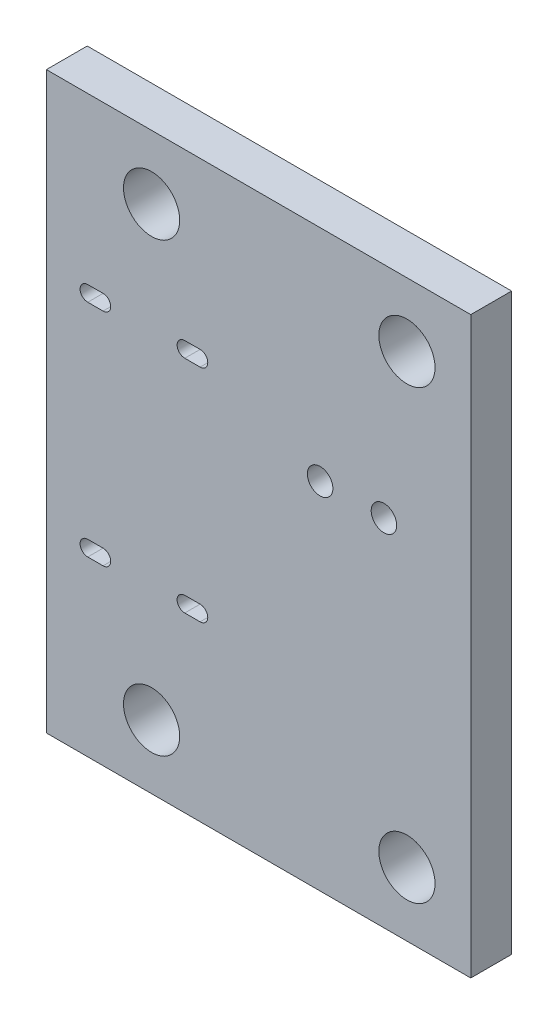
ISO-10303-21;
HEADER;
FILE_DESCRIPTION(('STEP AP214'),'2;1');
FILE_NAME('part.step','',(''),(''),'','','');
FILE_SCHEMA(('AUTOMOTIVE_DESIGN { 1 0 10303 214 1 1 1 1 }'));
ENDSEC;
DATA;
#1=APPLICATION_CONTEXT('core data for automotive mechanical design processes');
#2=APPLICATION_PROTOCOL_DEFINITION('international standard','automotive_design',2000,#1);
#3=PRODUCT_CONTEXT('',#1,'mechanical');
#4=PRODUCT('Part','Part','',(#3));
#5=PRODUCT_RELATED_PRODUCT_CATEGORY('part','',(#4));
#6=PRODUCT_DEFINITION_FORMATION('','',#4);
#7=PRODUCT_DEFINITION_CONTEXT('part definition',#1,'design');
#8=PRODUCT_DEFINITION('design','',#6,#7);
#9=PRODUCT_DEFINITION_SHAPE('','',#8);
#10=(LENGTH_UNIT() NAMED_UNIT(*) SI_UNIT(.MILLI.,.METRE.));
#11=(NAMED_UNIT(*) PLANE_ANGLE_UNIT() SI_UNIT($,.RADIAN.));
#12=(NAMED_UNIT(*) SI_UNIT($,.STERADIAN.) SOLID_ANGLE_UNIT());
#13=UNCERTAINTY_MEASURE_WITH_UNIT(LENGTH_MEASURE(1.E-05),#10,'distance_accuracy_value','');
#14=(GEOMETRIC_REPRESENTATION_CONTEXT(3) GLOBAL_UNCERTAINTY_ASSIGNED_CONTEXT((#13)) GLOBAL_UNIT_ASSIGNED_CONTEXT((#10,
#11,#12)) REPRESENTATION_CONTEXT('',''));
#15=CARTESIAN_POINT('',(0.,0.,0.));
#16=DIRECTION('',(0.,0.,1.));
#17=DIRECTION('',(1.,0.,0.));
#18=AXIS2_PLACEMENT_3D('',#15,#16,#17);
#19=CARTESIAN_POINT('',(120.,-85.,-0.8));
#20=DIRECTION('',(0.,0.,1.));
#21=DIRECTION('',(1.,0.,0.));
#22=AXIS2_PLACEMENT_3D('',#19,#20,#21);
#23=CYLINDRICAL_SURFACE('',#22,1.1);
#24=DIRECTION('',(0.,0.,1.));
#25=VECTOR('',#24,1.);
#26=CARTESIAN_POINT('',(121.1,-85.,-0.8));
#27=LINE('',#26,#25);
#28=CARTESIAN_POINT('',(121.1,-85.,0.));
#29=VERTEX_POINT('',#28);
#30=CARTESIAN_POINT('',(121.1,-85.,1.6));
#31=VERTEX_POINT('',#30);
#32=EDGE_CURVE('E11',#29,#31,#27,.T.);
#33=ORIENTED_EDGE('',*,*,#32,.F.);
#34=CARTESIAN_POINT('',(120.,-85.,0.));
#35=DIRECTION('',(0.,0.,1.));
#36=DIRECTION('',(1.,0.,0.));
#37=AXIS2_PLACEMENT_3D('',#34,#35,#36);
#38=CIRCLE('',#37,1.1);
#39=EDGE_CURVE('E295',#29,#29,#38,.T.);
#40=ORIENTED_EDGE('',*,*,#39,.F.);
#41=ORIENTED_EDGE('',*,*,#32,.T.);
#42=CARTESIAN_POINT('',(120.,-85.,1.6));
#43=DIRECTION('',(0.,0.,1.));
#44=DIRECTION('',(1.,0.,0.));
#45=AXIS2_PLACEMENT_3D('',#42,#43,#44);
#46=CIRCLE('',#45,1.1);
#47=EDGE_CURVE('E285',#31,#31,#46,.T.);
#48=ORIENTED_EDGE('',*,*,#47,.T.);
#49=EDGE_LOOP('',(#33,#40,#41,#48));
#50=FACE_BOUND('',#49,.T.);
#51=ADVANCED_FACE('F17',(#50),#23,.F.);
#52=CARTESIAN_POINT('',(118.1,-88.98,0.));
#53=DIRECTION('',(0.,-1.,0.));
#54=DIRECTION('',(0.,0.,-1.));
#55=AXIS2_PLACEMENT_3D('',#52,#53,#54);
#56=PLANE('',#55);
#57=DIRECTION('',(0.,0.,1.));
#58=VECTOR('',#57,1.);
#59=CARTESIAN_POINT('',(118.1,-88.98,0.));
#60=LINE('',#59,#58);
#61=CARTESIAN_POINT('',(118.1,-88.98,0.));
#62=VERTEX_POINT('',#61);
#63=CARTESIAN_POINT('',(118.1,-88.98,1.6));
#64=VERTEX_POINT('',#63);
#65=EDGE_CURVE('E21',#62,#64,#60,.T.);
#66=ORIENTED_EDGE('',*,*,#65,.T.);
#67=DIRECTION('',(-1.,0.,0.));
#68=VECTOR('',#67,1.);
#69=CARTESIAN_POINT('',(118.1,-88.98,1.6));
#70=LINE('',#69,#68);
#71=CARTESIAN_POINT('',(117.5,-88.98,1.6));
#72=VERTEX_POINT('',#71);
#73=EDGE_CURVE('E380',#64,#72,#70,.T.);
#74=ORIENTED_EDGE('',*,*,#73,.T.);
#75=DIRECTION('',(0.,0.,1.));
#76=VECTOR('',#75,1.);
#77=CARTESIAN_POINT('',(117.5,-88.98,0.));
#78=LINE('',#77,#76);
#79=CARTESIAN_POINT('',(117.5,-88.98,0.));
#80=VERTEX_POINT('',#79);
#81=EDGE_CURVE('E28',#80,#72,#78,.T.);
#82=ORIENTED_EDGE('',*,*,#81,.F.);
#83=DIRECTION('',(-1.,0.,0.));
#84=VECTOR('',#83,1.);
#85=CARTESIAN_POINT('',(118.1,-88.98,0.));
#86=LINE('',#85,#84);
#87=EDGE_CURVE('E351',#62,#80,#86,.T.);
#88=ORIENTED_EDGE('',*,*,#87,.F.);
#89=EDGE_LOOP('',(#66,#74,#82,#88));
#90=FACE_BOUND('',#89,.T.);
#91=ADVANCED_FACE('F489',(#90),#56,.T.);
#92=CARTESIAN_POINT('',(117.5,-89.28,0.));
#93=DIRECTION('',(0.,0.,-1.));
#94=DIRECTION('',(1.,0.,0.));
#95=AXIS2_PLACEMENT_3D('',#92,#93,#94);
#96=CYLINDRICAL_SURFACE('',#95,0.3);
#97=ORIENTED_EDGE('',*,*,#81,.T.);
#98=CARTESIAN_POINT('',(117.5,-89.28,1.6));
#99=DIRECTION('',(0.,0.,1.));
#100=DIRECTION('',(1.,0.,0.));
#101=AXIS2_PLACEMENT_3D('',#98,#99,#100);
#102=CIRCLE('',#101,0.3);
#103=CARTESIAN_POINT('',(117.5,-89.58,1.6));
#104=VERTEX_POINT('',#103);
#105=EDGE_CURVE('E413',#72,#104,#102,.T.);
#106=ORIENTED_EDGE('',*,*,#105,.T.);
#107=DIRECTION('',(0.,0.,1.));
#108=VECTOR('',#107,1.);
#109=CARTESIAN_POINT('',(117.5,-89.58,0.));
#110=LINE('',#109,#108);
#111=CARTESIAN_POINT('',(117.5,-89.58,0.));
#112=VERTEX_POINT('',#111);
#113=EDGE_CURVE('E432',#112,#104,#110,.T.);
#114=ORIENTED_EDGE('',*,*,#113,.F.);
#115=CARTESIAN_POINT('',(117.5,-89.28,0.));
#116=DIRECTION('',(0.,0.,1.));
#117=DIRECTION('',(1.,0.,0.));
#118=AXIS2_PLACEMENT_3D('',#115,#116,#117);
#119=CIRCLE('',#118,0.3);
#120=EDGE_CURVE('E355',#80,#112,#119,.T.);
#121=ORIENTED_EDGE('',*,*,#120,.F.);
#122=EDGE_LOOP('',(#97,#106,#114,#121));
#123=FACE_BOUND('',#122,.T.);
#124=ADVANCED_FACE('F484',(#123),#96,.F.);
#125=CARTESIAN_POINT('',(117.5,-89.58,0.));
#126=DIRECTION('',(0.,1.,0.));
#127=DIRECTION('',(1.,0.,0.));
#128=AXIS2_PLACEMENT_3D('',#125,#126,#127);
#129=PLANE('',#128);
#130=ORIENTED_EDGE('',*,*,#113,.T.);
#131=DIRECTION('',(1.,0.,0.));
#132=VECTOR('',#131,1.);
#133=CARTESIAN_POINT('',(117.5,-89.58,1.6));
#134=LINE('',#133,#132);
#135=CARTESIAN_POINT('',(118.1,-89.58,1.6));
#136=VERTEX_POINT('',#135);
#137=EDGE_CURVE('E363',#104,#136,#134,.T.);
#138=ORIENTED_EDGE('',*,*,#137,.T.);
#139=DIRECTION('',(0.,0.,1.));
#140=VECTOR('',#139,1.);
#141=CARTESIAN_POINT('',(118.1,-89.58,0.));
#142=LINE('',#141,#140);
#143=CARTESIAN_POINT('',(118.1,-89.58,0.));
#144=VERTEX_POINT('',#143);
#145=EDGE_CURVE('E269',#144,#136,#142,.T.);
#146=ORIENTED_EDGE('',*,*,#145,.F.);
#147=DIRECTION('',(1.,0.,0.));
#148=VECTOR('',#147,1.);
#149=CARTESIAN_POINT('',(117.5,-89.58,0.));
#150=LINE('',#149,#148);
#151=EDGE_CURVE('E300',#112,#144,#150,.T.);
#152=ORIENTED_EDGE('',*,*,#151,.F.);
#153=EDGE_LOOP('',(#130,#138,#146,#152));
#154=FACE_BOUND('',#153,.T.);
#155=ADVANCED_FACE('F694',(#154),#129,.T.);
#156=CARTESIAN_POINT('',(118.1,-89.28,0.));
#157=DIRECTION('',(0.,0.,-1.));
#158=DIRECTION('',(1.,0.,0.));
#159=AXIS2_PLACEMENT_3D('',#156,#157,#158);
#160=CYLINDRICAL_SURFACE('',#159,0.3);
#161=ORIENTED_EDGE('',*,*,#145,.T.);
#162=CARTESIAN_POINT('',(118.1,-89.28,1.6));
#163=DIRECTION('',(0.,0.,1.));
#164=DIRECTION('',(1.,0.,0.));
#165=AXIS2_PLACEMENT_3D('',#162,#163,#164);
#166=CIRCLE('',#165,0.3);
#167=EDGE_CURVE('E289',#136,#64,#166,.T.);
#168=ORIENTED_EDGE('',*,*,#167,.T.);
#169=ORIENTED_EDGE('',*,*,#65,.F.);
#170=CARTESIAN_POINT('',(118.1,-89.28,0.));
#171=DIRECTION('',(0.,0.,1.));
#172=DIRECTION('',(1.,0.,0.));
#173=AXIS2_PLACEMENT_3D('',#170,#171,#172);
#174=CIRCLE('',#173,0.3);
#175=EDGE_CURVE('E321',#144,#62,#174,.T.);
#176=ORIENTED_EDGE('',*,*,#175,.F.);
#177=EDGE_LOOP('',(#161,#168,#169,#176));
#178=FACE_BOUND('',#177,.T.);
#179=ADVANCED_FACE('F688',(#178),#160,.F.);
#180=CARTESIAN_POINT('',(121.9,-88.98,0.));
#181=DIRECTION('',(0.,-1.,0.));
#182=DIRECTION('',(0.,0.,-1.));
#183=AXIS2_PLACEMENT_3D('',#180,#181,#182);
#184=PLANE('',#183);
#185=DIRECTION('',(0.,0.,1.));
#186=VECTOR('',#185,1.);
#187=CARTESIAN_POINT('',(121.9,-88.98,0.));
#188=LINE('',#187,#186);
#189=CARTESIAN_POINT('',(121.9,-88.98,0.));
#190=VERTEX_POINT('',#189);
#191=CARTESIAN_POINT('',(121.9,-88.98,1.6));
#192=VERTEX_POINT('',#191);
#193=EDGE_CURVE('E336',#190,#192,#188,.T.);
#194=ORIENTED_EDGE('',*,*,#193,.T.);
#195=DIRECTION('',(-1.,0.,0.));
#196=VECTOR('',#195,1.);
#197=CARTESIAN_POINT('',(121.9,-88.98,1.6));
#198=LINE('',#197,#196);
#199=CARTESIAN_POINT('',(121.3,-88.98,1.6));
#200=VERTEX_POINT('',#199);
#201=EDGE_CURVE('E364',#192,#200,#198,.T.);
#202=ORIENTED_EDGE('',*,*,#201,.T.);
#203=DIRECTION('',(0.,0.,1.));
#204=VECTOR('',#203,1.);
#205=CARTESIAN_POINT('',(121.3,-88.98,0.));
#206=LINE('',#205,#204);
#207=CARTESIAN_POINT('',(121.3,-88.98,0.));
#208=VERTEX_POINT('',#207);
#209=EDGE_CURVE('E266',#208,#200,#206,.T.);
#210=ORIENTED_EDGE('',*,*,#209,.F.);
#211=DIRECTION('',(-1.,0.,0.));
#212=VECTOR('',#211,1.);
#213=CARTESIAN_POINT('',(121.9,-88.98,0.));
#214=LINE('',#213,#212);
#215=EDGE_CURVE('E349',#190,#208,#214,.T.);
#216=ORIENTED_EDGE('',*,*,#215,.F.);
#217=EDGE_LOOP('',(#194,#202,#210,#216));
#218=FACE_BOUND('',#217,.T.);
#219=ADVANCED_FACE('F659',(#218),#184,.T.);
#220=CARTESIAN_POINT('',(121.3,-89.28,0.));
#221=DIRECTION('',(0.,0.,-1.));
#222=DIRECTION('',(1.,0.,0.));
#223=AXIS2_PLACEMENT_3D('',#220,#221,#222);
#224=CYLINDRICAL_SURFACE('',#223,0.3);
#225=ORIENTED_EDGE('',*,*,#209,.T.);
#226=CARTESIAN_POINT('',(121.3,-89.28,1.6));
#227=DIRECTION('',(0.,0.,1.));
#228=DIRECTION('',(1.,0.,0.));
#229=AXIS2_PLACEMENT_3D('',#226,#227,#228);
#230=CIRCLE('',#229,0.3);
#231=CARTESIAN_POINT('',(121.3,-89.58,1.6));
#232=VERTEX_POINT('',#231);
#233=EDGE_CURVE('E258',#200,#232,#230,.T.);
#234=ORIENTED_EDGE('',*,*,#233,.T.);
#235=DIRECTION('',(0.,0.,1.));
#236=VECTOR('',#235,1.);
#237=CARTESIAN_POINT('',(121.3,-89.58,0.));
#238=LINE('',#237,#236);
#239=CARTESIAN_POINT('',(121.3,-89.58,0.));
#240=VERTEX_POINT('',#239);
#241=EDGE_CURVE('E270',#240,#232,#238,.T.);
#242=ORIENTED_EDGE('',*,*,#241,.F.);
#243=CARTESIAN_POINT('',(121.3,-89.28,0.));
#244=DIRECTION('',(0.,0.,1.));
#245=DIRECTION('',(1.,0.,0.));
#246=AXIS2_PLACEMENT_3D('',#243,#244,#245);
#247=CIRCLE('',#246,0.3);
#248=EDGE_CURVE('E322',#208,#240,#247,.T.);
#249=ORIENTED_EDGE('',*,*,#248,.F.);
#250=EDGE_LOOP('',(#225,#234,#242,#249));
#251=FACE_BOUND('',#250,.T.);
#252=ADVANCED_FACE('F647',(#251),#224,.F.);
#253=CARTESIAN_POINT('',(121.3,-89.58,0.));
#254=DIRECTION('',(0.,1.,0.));
#255=DIRECTION('',(1.,0.,0.));
#256=AXIS2_PLACEMENT_3D('',#253,#254,#255);
#257=PLANE('',#256);
#258=ORIENTED_EDGE('',*,*,#241,.T.);
#259=DIRECTION('',(1.,0.,0.));
#260=VECTOR('',#259,1.);
#261=CARTESIAN_POINT('',(121.3,-89.58,1.6));
#262=LINE('',#261,#260);
#263=CARTESIAN_POINT('',(121.9,-89.58,1.6));
#264=VERTEX_POINT('',#263);
#265=EDGE_CURVE('E255',#232,#264,#262,.T.);
#266=ORIENTED_EDGE('',*,*,#265,.T.);
#267=DIRECTION('',(0.,0.,1.));
#268=VECTOR('',#267,1.);
#269=CARTESIAN_POINT('',(121.9,-89.58,0.));
#270=LINE('',#269,#268);
#271=CARTESIAN_POINT('',(121.9,-89.58,0.));
#272=VERTEX_POINT('',#271);
#273=EDGE_CURVE('E331',#272,#264,#270,.T.);
#274=ORIENTED_EDGE('',*,*,#273,.F.);
#275=DIRECTION('',(1.,0.,0.));
#276=VECTOR('',#275,1.);
#277=CARTESIAN_POINT('',(121.3,-89.58,0.));
#278=LINE('',#277,#276);
#279=EDGE_CURVE('E317',#240,#272,#278,.T.);
#280=ORIENTED_EDGE('',*,*,#279,.F.);
#281=EDGE_LOOP('',(#258,#266,#274,#280));
#282=FACE_BOUND('',#281,.T.);
#283=ADVANCED_FACE('F638',(#282),#257,.T.);
#284=CARTESIAN_POINT('',(121.9,-89.28,0.));
#285=DIRECTION('',(0.,0.,-1.));
#286=DIRECTION('',(1.,0.,0.));
#287=AXIS2_PLACEMENT_3D('',#284,#285,#286);
#288=CYLINDRICAL_SURFACE('',#287,0.3);
#289=ORIENTED_EDGE('',*,*,#273,.T.);
#290=CARTESIAN_POINT('',(121.9,-89.28,1.6));
#291=DIRECTION('',(0.,0.,1.));
#292=DIRECTION('',(1.,0.,0.));
#293=AXIS2_PLACEMENT_3D('',#290,#291,#292);
#294=CIRCLE('',#293,0.3);
#295=EDGE_CURVE('E359',#264,#192,#294,.T.);
#296=ORIENTED_EDGE('',*,*,#295,.T.);
#297=ORIENTED_EDGE('',*,*,#193,.F.);
#298=CARTESIAN_POINT('',(121.9,-89.28,0.));
#299=DIRECTION('',(0.,0.,1.));
#300=DIRECTION('',(1.,0.,0.));
#301=AXIS2_PLACEMENT_3D('',#298,#299,#300);
#302=CIRCLE('',#301,0.3);
#303=EDGE_CURVE('E346',#272,#190,#302,.T.);
#304=ORIENTED_EDGE('',*,*,#303,.F.);
#305=EDGE_LOOP('',(#289,#296,#297,#304));
#306=FACE_BOUND('',#305,.T.);
#307=ADVANCED_FACE('F635',(#306),#288,.F.);
#308=CARTESIAN_POINT('',(130.,-85.,-0.8));
#309=DIRECTION('',(0.,0.,1.));
#310=DIRECTION('',(1.,0.,0.));
#311=AXIS2_PLACEMENT_3D('',#308,#309,#310);
#312=CYLINDRICAL_SURFACE('',#311,1.1);
#313=DIRECTION('',(0.,0.,1.));
#314=VECTOR('',#313,1.);
#315=CARTESIAN_POINT('',(131.1,-85.,-0.8));
#316=LINE('',#315,#314);
#317=CARTESIAN_POINT('',(131.1,-85.,0.));
#318=VERTEX_POINT('',#317);
#319=CARTESIAN_POINT('',(131.1,-85.,1.6));
#320=VERTEX_POINT('',#319);
#321=EDGE_CURVE('E328',#318,#320,#316,.T.);
#322=ORIENTED_EDGE('',*,*,#321,.F.);
#323=CARTESIAN_POINT('',(130.,-85.,0.));
#324=DIRECTION('',(0.,0.,1.));
#325=DIRECTION('',(1.,0.,0.));
#326=AXIS2_PLACEMENT_3D('',#323,#324,#325);
#327=CIRCLE('',#326,1.1);
#328=EDGE_CURVE('E264',#318,#318,#327,.T.);
#329=ORIENTED_EDGE('',*,*,#328,.F.);
#330=ORIENTED_EDGE('',*,*,#321,.T.);
#331=CARTESIAN_POINT('',(130.,-85.,1.6));
#332=DIRECTION('',(0.,0.,1.));
#333=DIRECTION('',(1.,0.,0.));
#334=AXIS2_PLACEMENT_3D('',#331,#332,#333);
#335=CIRCLE('',#334,1.1);
#336=EDGE_CURVE('E259',#320,#320,#335,.T.);
#337=ORIENTED_EDGE('',*,*,#336,.T.);
#338=EDGE_LOOP('',(#322,#329,#330,#337));
#339=FACE_BOUND('',#338,.T.);
#340=ADVANCED_FACE('F637',(#339),#312,.F.);
#341=CARTESIAN_POINT('',(126.6,-91.1,-0.8));
#342=DIRECTION('',(0.,0.,1.));
#343=DIRECTION('',(1.,0.,0.));
#344=AXIS2_PLACEMENT_3D('',#341,#342,#343);
#345=CYLINDRICAL_SURFACE('',#344,0.5);
#346=DIRECTION('',(0.,0.,1.));
#347=VECTOR('',#346,1.);
#348=CARTESIAN_POINT('',(127.1,-91.1,-0.8));
#349=LINE('',#348,#347);
#350=CARTESIAN_POINT('',(127.1,-91.1,0.));
#351=VERTEX_POINT('',#350);
#352=CARTESIAN_POINT('',(127.1,-91.1,1.6));
#353=VERTEX_POINT('',#352);
#354=EDGE_CURVE('E332',#351,#353,#349,.T.);
#355=ORIENTED_EDGE('',*,*,#354,.F.);
#356=CARTESIAN_POINT('',(126.6,-91.1,0.));
#357=DIRECTION('',(0.,0.,1.));
#358=DIRECTION('',(1.,0.,0.));
#359=AXIS2_PLACEMENT_3D('',#356,#357,#358);
#360=CIRCLE('',#359,0.5);
#361=EDGE_CURVE('E260',#351,#351,#360,.T.);
#362=ORIENTED_EDGE('',*,*,#361,.F.);
#363=ORIENTED_EDGE('',*,*,#354,.T.);
#364=CARTESIAN_POINT('',(126.6,-91.1,1.6));
#365=DIRECTION('',(0.,0.,1.));
#366=DIRECTION('',(1.,0.,0.));
#367=AXIS2_PLACEMENT_3D('',#364,#365,#366);
#368=CIRCLE('',#367,0.5);
#369=EDGE_CURVE('E345',#353,#353,#368,.T.);
#370=ORIENTED_EDGE('',*,*,#369,.T.);
#371=EDGE_LOOP('',(#355,#362,#363,#370));
#372=FACE_BOUND('',#371,.T.);
#373=ADVANCED_FACE('F644',(#372),#345,.F.);
#374=CARTESIAN_POINT('',(129.1,-91.1,-0.8));
#375=DIRECTION('',(0.,0.,1.));
#376=DIRECTION('',(1.,0.,0.));
#377=AXIS2_PLACEMENT_3D('',#374,#375,#376);
#378=CYLINDRICAL_SURFACE('',#377,0.5);
#379=DIRECTION('',(0.,0.,1.));
#380=VECTOR('',#379,1.);
#381=CARTESIAN_POINT('',(129.6,-91.1,-0.8));
#382=LINE('',#381,#380);
#383=CARTESIAN_POINT('',(129.6,-91.1,0.));
#384=VERTEX_POINT('',#383);
#385=CARTESIAN_POINT('',(129.6,-91.1,1.6));
#386=VERTEX_POINT('',#385);
#387=EDGE_CURVE('E387',#384,#386,#382,.T.);
#388=ORIENTED_EDGE('',*,*,#387,.F.);
#389=CARTESIAN_POINT('',(129.1,-91.1,0.));
#390=DIRECTION('',(0.,0.,1.));
#391=DIRECTION('',(1.,0.,0.));
#392=AXIS2_PLACEMENT_3D('',#389,#390,#391);
#393=CIRCLE('',#392,0.5);
#394=EDGE_CURVE('E265',#384,#384,#393,.T.);
#395=ORIENTED_EDGE('',*,*,#394,.F.);
#396=ORIENTED_EDGE('',*,*,#387,.T.);
#397=CARTESIAN_POINT('',(129.1,-91.1,1.6));
#398=DIRECTION('',(0.,0.,1.));
#399=DIRECTION('',(1.,0.,0.));
#400=AXIS2_PLACEMENT_3D('',#397,#398,#399);
#401=CIRCLE('',#400,0.5);
#402=EDGE_CURVE('E315',#386,#386,#401,.T.);
#403=ORIENTED_EDGE('',*,*,#402,.T.);
#404=EDGE_LOOP('',(#388,#395,#396,#403));
#405=FACE_BOUND('',#404,.T.);
#406=ADVANCED_FACE('F668',(#405),#378,.F.);
#407=CARTESIAN_POINT('',(118.1,-97.62,0.));
#408=DIRECTION('',(0.,-1.,0.));
#409=DIRECTION('',(0.,0.,-1.));
#410=AXIS2_PLACEMENT_3D('',#407,#408,#409);
#411=PLANE('',#410);
#412=DIRECTION('',(0.,0.,1.));
#413=VECTOR('',#412,1.);
#414=CARTESIAN_POINT('',(118.1,-97.62,0.));
#415=LINE('',#414,#413);
#416=CARTESIAN_POINT('',(118.1,-97.62,0.));
#417=VERTEX_POINT('',#416);
#418=CARTESIAN_POINT('',(118.1,-97.62,1.6));
#419=VERTEX_POINT('',#418);
#420=EDGE_CURVE('E368',#417,#419,#415,.T.);
#421=ORIENTED_EDGE('',*,*,#420,.T.);
#422=DIRECTION('',(-1.,0.,0.));
#423=VECTOR('',#422,1.);
#424=CARTESIAN_POINT('',(118.1,-97.62,1.6));
#425=LINE('',#424,#423);
#426=CARTESIAN_POINT('',(117.5,-97.62,1.6));
#427=VERTEX_POINT('',#426);
#428=EDGE_CURVE('E316',#419,#427,#425,.T.);
#429=ORIENTED_EDGE('',*,*,#428,.T.);
#430=DIRECTION('',(0.,0.,1.));
#431=VECTOR('',#430,1.);
#432=CARTESIAN_POINT('',(117.5,-97.62,0.));
#433=LINE('',#432,#431);
#434=CARTESIAN_POINT('',(117.5,-97.62,0.));
#435=VERTEX_POINT('',#434);
#436=EDGE_CURVE('E416',#435,#427,#433,.T.);
#437=ORIENTED_EDGE('',*,*,#436,.F.);
#438=DIRECTION('',(-1.,0.,0.));
#439=VECTOR('',#438,1.);
#440=CARTESIAN_POINT('',(118.1,-97.62,0.));
#441=LINE('',#440,#439);
#442=EDGE_CURVE('E310',#417,#435,#441,.T.);
#443=ORIENTED_EDGE('',*,*,#442,.F.);
#444=EDGE_LOOP('',(#421,#429,#437,#443));
#445=FACE_BOUND('',#444,.T.);
#446=ADVANCED_FACE('F604',(#445),#411,.T.);
#447=CARTESIAN_POINT('',(117.5,-97.92,0.));
#448=DIRECTION('',(0.,0.,-1.));
#449=DIRECTION('',(1.,0.,0.));
#450=AXIS2_PLACEMENT_3D('',#447,#448,#449);
#451=CYLINDRICAL_SURFACE('',#450,0.3);
#452=ORIENTED_EDGE('',*,*,#436,.T.);
#453=CARTESIAN_POINT('',(117.5,-97.92,1.6));
#454=DIRECTION('',(0.,0.,1.));
#455=DIRECTION('',(1.,0.,0.));
#456=AXIS2_PLACEMENT_3D('',#453,#454,#455);
#457=CIRCLE('',#456,0.3);
#458=CARTESIAN_POINT('',(117.5,-98.22,1.6));
#459=VERTEX_POINT('',#458);
#460=EDGE_CURVE('E443',#427,#459,#457,.T.);
#461=ORIENTED_EDGE('',*,*,#460,.T.);
#462=DIRECTION('',(0.,0.,1.));
#463=VECTOR('',#462,1.);
#464=CARTESIAN_POINT('',(117.5,-98.22,0.));
#465=LINE('',#464,#463);
#466=CARTESIAN_POINT('',(117.5,-98.22,0.));
#467=VERTEX_POINT('',#466);
#468=EDGE_CURVE('E414',#467,#459,#465,.T.);
#469=ORIENTED_EDGE('',*,*,#468,.F.);
#470=CARTESIAN_POINT('',(117.5,-97.92,0.));
#471=DIRECTION('',(0.,0.,1.));
#472=DIRECTION('',(1.,0.,0.));
#473=AXIS2_PLACEMENT_3D('',#470,#471,#472);
#474=CIRCLE('',#473,0.3);
#475=EDGE_CURVE('E372',#435,#467,#474,.T.);
#476=ORIENTED_EDGE('',*,*,#475,.F.);
#477=EDGE_LOOP('',(#452,#461,#469,#476));
#478=FACE_BOUND('',#477,.T.);
#479=ADVANCED_FACE('F595',(#478),#451,.F.);
#480=CARTESIAN_POINT('',(117.5,-98.22,0.));
#481=DIRECTION('',(0.,1.,0.));
#482=DIRECTION('',(1.,0.,0.));
#483=AXIS2_PLACEMENT_3D('',#480,#481,#482);
#484=PLANE('',#483);
#485=ORIENTED_EDGE('',*,*,#468,.T.);
#486=DIRECTION('',(1.,0.,0.));
#487=VECTOR('',#486,1.);
#488=CARTESIAN_POINT('',(117.5,-98.22,1.6));
#489=LINE('',#488,#487);
#490=CARTESIAN_POINT('',(118.1,-98.22,1.6));
#491=VERTEX_POINT('',#490);
#492=EDGE_CURVE('E439',#459,#491,#489,.T.);
#493=ORIENTED_EDGE('',*,*,#492,.T.);
#494=DIRECTION('',(0.,0.,1.));
#495=VECTOR('',#494,1.);
#496=CARTESIAN_POINT('',(118.1,-98.22,0.));
#497=LINE('',#496,#495);
#498=CARTESIAN_POINT('',(118.1,-98.22,0.));
#499=VERTEX_POINT('',#498);
#500=EDGE_CURVE('E293',#499,#491,#497,.T.);
#501=ORIENTED_EDGE('',*,*,#500,.F.);
#502=DIRECTION('',(1.,0.,0.));
#503=VECTOR('',#502,1.);
#504=CARTESIAN_POINT('',(117.5,-98.22,0.));
#505=LINE('',#504,#503);
#506=EDGE_CURVE('E376',#467,#499,#505,.T.);
#507=ORIENTED_EDGE('',*,*,#506,.F.);
#508=EDGE_LOOP('',(#485,#493,#501,#507));
#509=FACE_BOUND('',#508,.T.);
#510=ADVANCED_FACE('F599',(#509),#484,.T.);
#511=CARTESIAN_POINT('',(118.1,-97.92,0.));
#512=DIRECTION('',(0.,0.,-1.));
#513=DIRECTION('',(1.,0.,0.));
#514=AXIS2_PLACEMENT_3D('',#511,#512,#513);
#515=CYLINDRICAL_SURFACE('',#514,0.3);
#516=ORIENTED_EDGE('',*,*,#500,.T.);
#517=CARTESIAN_POINT('',(118.1,-97.92,1.6));
#518=DIRECTION('',(0.,0.,1.));
#519=DIRECTION('',(1.,0.,0.));
#520=AXIS2_PLACEMENT_3D('',#517,#518,#519);
#521=CIRCLE('',#520,0.3);
#522=EDGE_CURVE('E311',#491,#419,#521,.T.);
#523=ORIENTED_EDGE('',*,*,#522,.T.);
#524=ORIENTED_EDGE('',*,*,#420,.F.);
#525=CARTESIAN_POINT('',(118.1,-97.92,0.));
#526=DIRECTION('',(0.,0.,1.));
#527=DIRECTION('',(1.,0.,0.));
#528=AXIS2_PLACEMENT_3D('',#525,#526,#527);
#529=CIRCLE('',#528,0.3);
#530=EDGE_CURVE('E236',#499,#417,#529,.T.);
#531=ORIENTED_EDGE('',*,*,#530,.F.);
#532=EDGE_LOOP('',(#516,#523,#524,#531));
#533=FACE_BOUND('',#532,.T.);
#534=ADVANCED_FACE('F612',(#533),#515,.F.);
#535=CARTESIAN_POINT('',(121.9,-97.62,0.));
#536=DIRECTION('',(0.,-1.,0.));
#537=DIRECTION('',(0.,0.,-1.));
#538=AXIS2_PLACEMENT_3D('',#535,#536,#537);
#539=PLANE('',#538);
#540=DIRECTION('',(0.,0.,1.));
#541=VECTOR('',#540,1.);
#542=CARTESIAN_POINT('',(121.9,-97.62,0.));
#543=LINE('',#542,#541);
#544=CARTESIAN_POINT('',(121.9,-97.62,0.));
#545=VERTEX_POINT('',#544);
#546=CARTESIAN_POINT('',(121.9,-97.62,1.6));
#547=VERTEX_POINT('',#546);
#548=EDGE_CURVE('E224',#545,#547,#543,.T.);
#549=ORIENTED_EDGE('',*,*,#548,.T.);
#550=DIRECTION('',(-1.,0.,0.));
#551=VECTOR('',#550,1.);
#552=CARTESIAN_POINT('',(121.9,-97.62,1.6));
#553=LINE('',#552,#551);
#554=CARTESIAN_POINT('',(121.3,-97.62,1.6));
#555=VERTEX_POINT('',#554);
#556=EDGE_CURVE('E327',#547,#555,#553,.T.);
#557=ORIENTED_EDGE('',*,*,#556,.T.);
#558=DIRECTION('',(0.,0.,1.));
#559=VECTOR('',#558,1.);
#560=CARTESIAN_POINT('',(121.3,-97.62,0.));
#561=LINE('',#560,#559);
#562=CARTESIAN_POINT('',(121.3,-97.62,0.));
#563=VERTEX_POINT('',#562);
#564=EDGE_CURVE('E290',#563,#555,#561,.T.);
#565=ORIENTED_EDGE('',*,*,#564,.F.);
#566=DIRECTION('',(-1.,0.,0.));
#567=VECTOR('',#566,1.);
#568=CARTESIAN_POINT('',(121.9,-97.62,0.));
#569=LINE('',#568,#567);
#570=EDGE_CURVE('E241',#545,#563,#569,.T.);
#571=ORIENTED_EDGE('',*,*,#570,.F.);
#572=EDGE_LOOP('',(#549,#557,#565,#571));
#573=FACE_BOUND('',#572,.T.);
#574=ADVANCED_FACE('F614',(#573),#539,.T.);
#575=CARTESIAN_POINT('',(121.3,-97.92,0.));
#576=DIRECTION('',(0.,0.,-1.));
#577=DIRECTION('',(1.,0.,0.));
#578=AXIS2_PLACEMENT_3D('',#575,#576,#577);
#579=CYLINDRICAL_SURFACE('',#578,0.3);
#580=ORIENTED_EDGE('',*,*,#564,.T.);
#581=CARTESIAN_POINT('',(121.3,-97.92,1.6));
#582=DIRECTION('',(0.,0.,1.));
#583=DIRECTION('',(1.,0.,0.));
#584=AXIS2_PLACEMENT_3D('',#581,#582,#583);
#585=CIRCLE('',#584,0.3);
#586=CARTESIAN_POINT('',(121.3,-98.22,1.6));
#587=VERTEX_POINT('',#586);
#588=EDGE_CURVE('E323',#555,#587,#585,.T.);
#589=ORIENTED_EDGE('',*,*,#588,.T.);
#590=DIRECTION('',(0.,0.,1.));
#591=VECTOR('',#590,1.);
#592=CARTESIAN_POINT('',(121.3,-98.22,0.));
#593=LINE('',#592,#591);
#594=CARTESIAN_POINT('',(121.3,-98.22,0.));
#595=VERTEX_POINT('',#594);
#596=EDGE_CURVE('E294',#595,#587,#593,.T.);
#597=ORIENTED_EDGE('',*,*,#596,.F.);
#598=CARTESIAN_POINT('',(121.3,-97.92,0.));
#599=DIRECTION('',(0.,0.,1.));
#600=DIRECTION('',(1.,0.,0.));
#601=AXIS2_PLACEMENT_3D('',#598,#599,#600);
#602=CIRCLE('',#601,0.3);
#603=EDGE_CURVE('E234',#563,#595,#602,.T.);
#604=ORIENTED_EDGE('',*,*,#603,.F.);
#605=EDGE_LOOP('',(#580,#589,#597,#604));
#606=FACE_BOUND('',#605,.T.);
#607=ADVANCED_FACE('F621',(#606),#579,.F.);
#608=CARTESIAN_POINT('',(121.3,-98.22,0.));
#609=DIRECTION('',(0.,1.,0.));
#610=DIRECTION('',(1.,0.,0.));
#611=AXIS2_PLACEMENT_3D('',#608,#609,#610);
#612=PLANE('',#611);
#613=ORIENTED_EDGE('',*,*,#596,.T.);
#614=DIRECTION('',(1.,0.,0.));
#615=VECTOR('',#614,1.);
#616=CARTESIAN_POINT('',(121.3,-98.22,1.6));
#617=LINE('',#616,#615);
#618=CARTESIAN_POINT('',(121.9,-98.22,1.6));
#619=VERTEX_POINT('',#618);
#620=EDGE_CURVE('E218',#587,#619,#617,.T.);
#621=ORIENTED_EDGE('',*,*,#620,.T.);
#622=DIRECTION('',(0.,0.,1.));
#623=VECTOR('',#622,1.);
#624=CARTESIAN_POINT('',(121.9,-98.22,0.));
#625=LINE('',#624,#623);
#626=CARTESIAN_POINT('',(121.9,-98.22,0.));
#627=VERTEX_POINT('',#626);
#628=EDGE_CURVE('E212',#627,#619,#625,.T.);
#629=ORIENTED_EDGE('',*,*,#628,.F.);
#630=DIRECTION('',(1.,0.,0.));
#631=VECTOR('',#630,1.);
#632=CARTESIAN_POINT('',(121.3,-98.22,0.));
#633=LINE('',#632,#631);
#634=EDGE_CURVE('E215',#595,#627,#633,.T.);
#635=ORIENTED_EDGE('',*,*,#634,.F.);
#636=EDGE_LOOP('',(#613,#621,#629,#635));
#637=FACE_BOUND('',#636,.T.);
#638=ADVANCED_FACE('F214',(#637),#612,.T.);
#639=CARTESIAN_POINT('',(121.9,-97.92,0.));
#640=DIRECTION('',(0.,0.,-1.));
#641=DIRECTION('',(1.,0.,0.));
#642=AXIS2_PLACEMENT_3D('',#639,#640,#641);
#643=CYLINDRICAL_SURFACE('',#642,0.3);
#644=ORIENTED_EDGE('',*,*,#628,.T.);
#645=CARTESIAN_POINT('',(121.9,-97.92,1.6));
#646=DIRECTION('',(0.,0.,1.));
#647=DIRECTION('',(1.,0.,0.));
#648=AXIS2_PLACEMENT_3D('',#645,#646,#647);
#649=CIRCLE('',#648,0.3);
#650=EDGE_CURVE('E444',#619,#547,#649,.T.);
#651=ORIENTED_EDGE('',*,*,#650,.T.);
#652=ORIENTED_EDGE('',*,*,#548,.F.);
#653=CARTESIAN_POINT('',(121.9,-97.92,0.));
#654=DIRECTION('',(0.,0.,1.));
#655=DIRECTION('',(1.,0.,0.));
#656=AXIS2_PLACEMENT_3D('',#653,#654,#655);
#657=CIRCLE('',#656,0.3);
#658=EDGE_CURVE('E232',#627,#545,#657,.T.);
#659=ORIENTED_EDGE('',*,*,#658,.F.);
#660=EDGE_LOOP('',(#644,#651,#652,#659));
#661=FACE_BOUND('',#660,.T.);
#662=ADVANCED_FACE('F238',(#661),#643,.F.);
#663=CARTESIAN_POINT('',(120.,-102.5,-0.8));
#664=DIRECTION('',(0.,0.,1.));
#665=DIRECTION('',(1.,0.,0.));
#666=AXIS2_PLACEMENT_3D('',#663,#664,#665);
#667=CYLINDRICAL_SURFACE('',#666,1.1);
#668=DIRECTION('',(0.,0.,1.));
#669=VECTOR('',#668,1.);
#670=CARTESIAN_POINT('',(121.1,-102.5,-0.8));
#671=LINE('',#670,#669);
#672=CARTESIAN_POINT('',(121.1,-102.5,0.));
#673=VERTEX_POINT('',#672);
#674=CARTESIAN_POINT('',(121.1,-102.5,1.6));
#675=VERTEX_POINT('',#674);
#676=EDGE_CURVE('E225',#673,#675,#671,.T.);
#677=ORIENTED_EDGE('',*,*,#676,.F.);
#678=CARTESIAN_POINT('',(120.,-102.5,0.));
#679=DIRECTION('',(0.,0.,1.));
#680=DIRECTION('',(1.,0.,0.));
#681=AXIS2_PLACEMENT_3D('',#678,#679,#680);
#682=CIRCLE('',#681,1.1);
#683=EDGE_CURVE('E242',#673,#673,#682,.T.);
#684=ORIENTED_EDGE('',*,*,#683,.F.);
#685=ORIENTED_EDGE('',*,*,#676,.T.);
#686=CARTESIAN_POINT('',(120.,-102.5,1.6));
#687=DIRECTION('',(0.,0.,1.));
#688=DIRECTION('',(1.,0.,0.));
#689=AXIS2_PLACEMENT_3D('',#686,#687,#688);
#690=CIRCLE('',#689,1.1);
#691=EDGE_CURVE('E280',#675,#675,#690,.T.);
#692=ORIENTED_EDGE('',*,*,#691,.T.);
#693=EDGE_LOOP('',(#677,#684,#685,#692));
#694=FACE_BOUND('',#693,.T.);
#695=ADVANCED_FACE('F703',(#694),#667,.F.);
#696=CARTESIAN_POINT('',(130.,-102.5,-0.8));
#697=DIRECTION('',(0.,0.,1.));
#698=DIRECTION('',(1.,0.,0.));
#699=AXIS2_PLACEMENT_3D('',#696,#697,#698);
#700=CYLINDRICAL_SURFACE('',#699,1.1);
#701=DIRECTION('',(0.,0.,1.));
#702=VECTOR('',#701,1.);
#703=CARTESIAN_POINT('',(131.1,-102.5,-0.8));
#704=LINE('',#703,#702);
#705=CARTESIAN_POINT('',(131.1,-102.5,0.));
#706=VERTEX_POINT('',#705);
#707=CARTESIAN_POINT('',(131.1,-102.5,1.6));
#708=VERTEX_POINT('',#707);
#709=EDGE_CURVE('E288',#706,#708,#704,.T.);
#710=ORIENTED_EDGE('',*,*,#709,.F.);
#711=CARTESIAN_POINT('',(130.,-102.5,0.));
#712=DIRECTION('',(0.,0.,1.));
#713=DIRECTION('',(1.,0.,0.));
#714=AXIS2_PLACEMENT_3D('',#711,#712,#713);
#715=CIRCLE('',#714,1.1);
#716=EDGE_CURVE('E251',#706,#706,#715,.T.);
#717=ORIENTED_EDGE('',*,*,#716,.F.);
#718=ORIENTED_EDGE('',*,*,#709,.T.);
#719=CARTESIAN_POINT('',(130.,-102.5,1.6));
#720=DIRECTION('',(0.,0.,1.));
#721=DIRECTION('',(1.,0.,0.));
#722=AXIS2_PLACEMENT_3D('',#719,#720,#721);
#723=CIRCLE('',#722,1.1);
#724=EDGE_CURVE('E284',#708,#708,#723,.T.);
#725=ORIENTED_EDGE('',*,*,#724,.T.);
#726=EDGE_LOOP('',(#710,#717,#718,#725));
#727=FACE_BOUND('',#726,.T.);
#728=ADVANCED_FACE('F678',(#727),#700,.F.);
#729=CARTESIAN_POINT('',(132.5,-82.5,0.));
#730=DIRECTION('',(1.,0.,0.));
#731=DIRECTION('',(0.,1.,0.));
#732=AXIS2_PLACEMENT_3D('',#729,#730,#731);
#733=PLANE('',#732);
#734=DIRECTION('',(0.,0.,1.));
#735=VECTOR('',#734,1.);
#736=CARTESIAN_POINT('',(132.5,-82.5,0.));
#737=LINE('',#736,#735);
#738=CARTESIAN_POINT('',(132.5,-82.5,0.));
#739=VERTEX_POINT('',#738);
#740=CARTESIAN_POINT('',(132.5,-82.5,1.6));
#741=VERTEX_POINT('',#740);
#742=EDGE_CURVE('E276',#739,#741,#737,.T.);
#743=ORIENTED_EDGE('',*,*,#742,.T.);
#744=DIRECTION('',(0.,-1.,0.));
#745=VECTOR('',#744,1.);
#746=CARTESIAN_POINT('',(132.5,-82.5,1.6));
#747=LINE('',#746,#745);
#748=CARTESIAN_POINT('',(132.5,-105.,1.6));
#749=VERTEX_POINT('',#748);
#750=EDGE_CURVE('E299',#741,#749,#747,.T.);
#751=ORIENTED_EDGE('',*,*,#750,.T.);
#752=DIRECTION('',(0.,0.,1.));
#753=VECTOR('',#752,1.);
#754=CARTESIAN_POINT('',(132.5,-105.,0.));
#755=LINE('',#754,#753);
#756=CARTESIAN_POINT('',(132.5,-105.,0.));
#757=VERTEX_POINT('',#756);
#758=EDGE_CURVE('E305',#757,#749,#755,.T.);
#759=ORIENTED_EDGE('',*,*,#758,.F.);
#760=DIRECTION('',(0.,-1.,0.));
#761=VECTOR('',#760,1.);
#762=CARTESIAN_POINT('',(132.5,-82.5,0.));
#763=LINE('',#762,#761);
#764=EDGE_CURVE('E275',#739,#757,#763,.T.);
#765=ORIENTED_EDGE('',*,*,#764,.F.);
#766=EDGE_LOOP('',(#743,#751,#759,#765));
#767=FACE_BOUND('',#766,.T.);
#768=ADVANCED_FACE('F672',(#767),#733,.T.);
#769=CARTESIAN_POINT('',(124.19,-93.75,1.6));
#770=DIRECTION('',(0.,0.,-1.));
#771=DIRECTION('',(0.,-1.,0.));
#772=AXIS2_PLACEMENT_3D('',#769,#770,#771);
#773=PLANE('',#772);
#774=ORIENTED_EDGE('',*,*,#47,.F.);
#775=EDGE_LOOP('',(#774));
#776=FACE_BOUND('',#775,.T.);
#777=ORIENTED_EDGE('',*,*,#137,.F.);
#778=ORIENTED_EDGE('',*,*,#105,.F.);
#779=ORIENTED_EDGE('',*,*,#73,.F.);
#780=ORIENTED_EDGE('',*,*,#167,.F.);
#781=EDGE_LOOP('',(#777,#778,#779,#780));
#782=FACE_BOUND('',#781,.T.);
#783=ORIENTED_EDGE('',*,*,#265,.F.);
#784=ORIENTED_EDGE('',*,*,#233,.F.);
#785=ORIENTED_EDGE('',*,*,#201,.F.);
#786=ORIENTED_EDGE('',*,*,#295,.F.);
#787=EDGE_LOOP('',(#783,#784,#785,#786));
#788=FACE_BOUND('',#787,.T.);
#789=ORIENTED_EDGE('',*,*,#336,.F.);
#790=EDGE_LOOP('',(#789));
#791=FACE_BOUND('',#790,.T.);
#792=ORIENTED_EDGE('',*,*,#369,.F.);
#793=EDGE_LOOP('',(#792));
#794=FACE_BOUND('',#793,.T.);
#795=ORIENTED_EDGE('',*,*,#402,.F.);
#796=EDGE_LOOP('',(#795));
#797=FACE_BOUND('',#796,.T.);
#798=ORIENTED_EDGE('',*,*,#492,.F.);
#799=ORIENTED_EDGE('',*,*,#460,.F.);
#800=ORIENTED_EDGE('',*,*,#428,.F.);
#801=ORIENTED_EDGE('',*,*,#522,.F.);
#802=EDGE_LOOP('',(#798,#799,#800,#801));
#803=FACE_BOUND('',#802,.T.);
#804=ORIENTED_EDGE('',*,*,#620,.F.);
#805=ORIENTED_EDGE('',*,*,#588,.F.);
#806=ORIENTED_EDGE('',*,*,#556,.F.);
#807=ORIENTED_EDGE('',*,*,#650,.F.);
#808=EDGE_LOOP('',(#804,#805,#806,#807));
#809=FACE_BOUND('',#808,.T.);
#810=ORIENTED_EDGE('',*,*,#691,.F.);
#811=EDGE_LOOP('',(#810));
#812=FACE_BOUND('',#811,.T.);
#813=ORIENTED_EDGE('',*,*,#724,.F.);
#814=EDGE_LOOP('',(#813));
#815=FACE_BOUND('',#814,.T.);
#816=DIRECTION('',(-1.,0.,0.));
#817=VECTOR('',#816,1.);
#818=CARTESIAN_POINT('',(132.5,-105.,1.6));
#819=LINE('',#818,#817);
#820=CARTESIAN_POINT('',(115.88,-105.,1.6));
#821=VERTEX_POINT('',#820);
#822=EDGE_CURVE('E401',#749,#821,#819,.T.);
#823=ORIENTED_EDGE('',*,*,#822,.F.);
#824=ORIENTED_EDGE('',*,*,#750,.F.);
#825=DIRECTION('',(1.,0.,0.));
#826=VECTOR('',#825,1.);
#827=CARTESIAN_POINT('',(115.88,-82.5,1.6));
#828=LINE('',#827,#826);
#829=CARTESIAN_POINT('',(115.88,-82.5,1.6));
#830=VERTEX_POINT('',#829);
#831=EDGE_CURVE('E400',#830,#741,#828,.T.);
#832=ORIENTED_EDGE('',*,*,#831,.F.);
#833=DIRECTION('',(0.,1.,0.));
#834=VECTOR('',#833,1.);
#835=CARTESIAN_POINT('',(115.88,-105.,1.6));
#836=LINE('',#835,#834);
#837=EDGE_CURVE('E402',#821,#830,#836,.T.);
#838=ORIENTED_EDGE('',*,*,#837,.F.);
#839=EDGE_LOOP('',(#823,#824,#832,#838));
#840=FACE_BOUND('',#839,.T.);
#841=ADVANCED_FACE('F493',(#776,#782,#788,#791,#794,#797,#803,#809,#812,#815,#840),#773,.F.);
#842=CARTESIAN_POINT('',(124.19,-93.75,0.));
#843=DIRECTION('',(0.,0.,-1.));
#844=DIRECTION('',(0.,-1.,0.));
#845=AXIS2_PLACEMENT_3D('',#842,#843,#844);
#846=PLANE('',#845);
#847=ORIENTED_EDGE('',*,*,#39,.T.);
#848=EDGE_LOOP('',(#847));
#849=FACE_BOUND('',#848,.T.);
#850=ORIENTED_EDGE('',*,*,#175,.T.);
#851=ORIENTED_EDGE('',*,*,#87,.T.);
#852=ORIENTED_EDGE('',*,*,#120,.T.);
#853=ORIENTED_EDGE('',*,*,#151,.T.);
#854=EDGE_LOOP('',(#850,#851,#852,#853));
#855=FACE_BOUND('',#854,.T.);
#856=ORIENTED_EDGE('',*,*,#303,.T.);
#857=ORIENTED_EDGE('',*,*,#215,.T.);
#858=ORIENTED_EDGE('',*,*,#248,.T.);
#859=ORIENTED_EDGE('',*,*,#279,.T.);
#860=EDGE_LOOP('',(#856,#857,#858,#859));
#861=FACE_BOUND('',#860,.T.);
#862=ORIENTED_EDGE('',*,*,#328,.T.);
#863=EDGE_LOOP('',(#862));
#864=FACE_BOUND('',#863,.T.);
#865=ORIENTED_EDGE('',*,*,#361,.T.);
#866=EDGE_LOOP('',(#865));
#867=FACE_BOUND('',#866,.T.);
#868=ORIENTED_EDGE('',*,*,#394,.T.);
#869=EDGE_LOOP('',(#868));
#870=FACE_BOUND('',#869,.T.);
#871=ORIENTED_EDGE('',*,*,#530,.T.);
#872=ORIENTED_EDGE('',*,*,#442,.T.);
#873=ORIENTED_EDGE('',*,*,#475,.T.);
#874=ORIENTED_EDGE('',*,*,#506,.T.);
#875=EDGE_LOOP('',(#871,#872,#873,#874));
#876=FACE_BOUND('',#875,.T.);
#877=ORIENTED_EDGE('',*,*,#658,.T.);
#878=ORIENTED_EDGE('',*,*,#570,.T.);
#879=ORIENTED_EDGE('',*,*,#603,.T.);
#880=ORIENTED_EDGE('',*,*,#634,.T.);
#881=EDGE_LOOP('',(#877,#878,#879,#880));
#882=FACE_BOUND('',#881,.T.);
#883=ORIENTED_EDGE('',*,*,#683,.T.);
#884=EDGE_LOOP('',(#883));
#885=FACE_BOUND('',#884,.T.);
#886=ORIENTED_EDGE('',*,*,#716,.T.);
#887=EDGE_LOOP('',(#886));
#888=FACE_BOUND('',#887,.T.);
#889=DIRECTION('',(0.,1.,0.));
#890=VECTOR('',#889,1.);
#891=CARTESIAN_POINT('',(115.88,-105.,0.));
#892=LINE('',#891,#890);
#893=CARTESIAN_POINT('',(115.88,-105.,0.));
#894=VERTEX_POINT('',#893);
#895=CARTESIAN_POINT('',(115.88,-82.5,0.));
#896=VERTEX_POINT('',#895);
#897=EDGE_CURVE('E301',#894,#896,#892,.T.);
#898=ORIENTED_EDGE('',*,*,#897,.T.);
#899=DIRECTION('',(1.,0.,0.));
#900=VECTOR('',#899,1.);
#901=CARTESIAN_POINT('',(115.88,-82.5,0.));
#902=LINE('',#901,#900);
#903=EDGE_CURVE('E271',#896,#739,#902,.T.);
#904=ORIENTED_EDGE('',*,*,#903,.T.);
#905=ORIENTED_EDGE('',*,*,#764,.T.);
#906=DIRECTION('',(-1.,0.,0.));
#907=VECTOR('',#906,1.);
#908=CARTESIAN_POINT('',(132.5,-105.,0.));
#909=LINE('',#908,#907);
#910=EDGE_CURVE('E397',#757,#894,#909,.T.);
#911=ORIENTED_EDGE('',*,*,#910,.T.);
#912=EDGE_LOOP('',(#898,#904,#905,#911));
#913=FACE_BOUND('',#912,.T.);
#914=ADVANCED_FACE('F229',(#849,#855,#861,#864,#867,#870,#876,#882,#885,#888,#913),#846,.T.);
#915=CARTESIAN_POINT('',(115.88,-82.5,0.));
#916=DIRECTION('',(0.,1.,0.));
#917=DIRECTION('',(1.,0.,0.));
#918=AXIS2_PLACEMENT_3D('',#915,#916,#917);
#919=PLANE('',#918);
#920=DIRECTION('',(0.,0.,1.));
#921=VECTOR('',#920,1.);
#922=CARTESIAN_POINT('',(115.88,-82.5,0.));
#923=LINE('',#922,#921);
#924=EDGE_CURVE('E306',#896,#830,#923,.T.);
#925=ORIENTED_EDGE('',*,*,#924,.T.);
#926=ORIENTED_EDGE('',*,*,#831,.T.);
#927=ORIENTED_EDGE('',*,*,#742,.F.);
#928=ORIENTED_EDGE('',*,*,#903,.F.);
#929=EDGE_LOOP('',(#925,#926,#927,#928));
#930=FACE_BOUND('',#929,.T.);
#931=ADVANCED_FACE('F536',(#930),#919,.T.);
#932=CARTESIAN_POINT('',(132.5,-105.,0.));
#933=DIRECTION('',(0.,-1.,0.));
#934=DIRECTION('',(0.,0.,-1.));
#935=AXIS2_PLACEMENT_3D('',#932,#933,#934);
#936=PLANE('',#935);
#937=ORIENTED_EDGE('',*,*,#758,.T.);
#938=ORIENTED_EDGE('',*,*,#822,.T.);
#939=DIRECTION('',(0.,0.,1.));
#940=VECTOR('',#939,1.);
#941=CARTESIAN_POINT('',(115.88,-105.,0.));
#942=LINE('',#941,#940);
#943=EDGE_CURVE('E406',#894,#821,#942,.T.);
#944=ORIENTED_EDGE('',*,*,#943,.F.);
#945=ORIENTED_EDGE('',*,*,#910,.F.);
#946=EDGE_LOOP('',(#937,#938,#944,#945));
#947=FACE_BOUND('',#946,.T.);
#948=ADVANCED_FACE('F19',(#947),#936,.T.);
#949=CARTESIAN_POINT('',(115.88,-105.,0.));
#950=DIRECTION('',(-1.,0.,0.));
#951=DIRECTION('',(0.,0.,1.));
#952=AXIS2_PLACEMENT_3D('',#949,#950,#951);
#953=PLANE('',#952);
#954=ORIENTED_EDGE('',*,*,#943,.T.);
#955=ORIENTED_EDGE('',*,*,#837,.T.);
#956=ORIENTED_EDGE('',*,*,#924,.F.);
#957=ORIENTED_EDGE('',*,*,#897,.F.);
#958=EDGE_LOOP('',(#954,#955,#956,#957));
#959=FACE_BOUND('',#958,.T.);
#960=ADVANCED_FACE('F542',(#959),#953,.T.);
#961=CLOSED_SHELL('',(#51,#91,#124,#155,#179,#219,#252,#283,#307,#340,#373,#406,#446,#479,#510,
#534,#574,#607,#638,#662,#695,#728,#768,#841,#914,#931,#948,#960));
#962=MANIFOLD_SOLID_BREP('B1',#961);
#963=ADVANCED_BREP_SHAPE_REPRESENTATION('',(#18,#962),#14);
#964=SHAPE_DEFINITION_REPRESENTATION(#9,#963);
ENDSEC;
END-ISO-10303-21;
